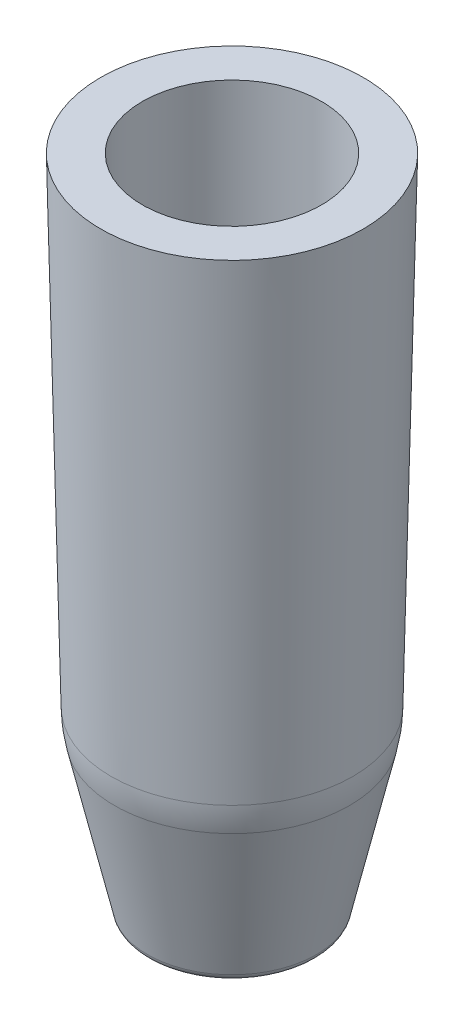
ISO-10303-21;
HEADER;
FILE_DESCRIPTION(('STEP AP214'),'2;1');
FILE_NAME('part.step','',(''),(''),'','','');
FILE_SCHEMA(('AUTOMOTIVE_DESIGN { 1 0 10303 214 1 1 1 1 }'));
ENDSEC;
DATA;
#1=APPLICATION_CONTEXT('core data for automotive mechanical design processes');
#2=APPLICATION_PROTOCOL_DEFINITION('international standard','automotive_design',2000,#1);
#3=PRODUCT_CONTEXT('',#1,'mechanical');
#4=PRODUCT('Part','Part','',(#3));
#5=PRODUCT_RELATED_PRODUCT_CATEGORY('part','',(#4));
#6=PRODUCT_DEFINITION_FORMATION('','',#4);
#7=PRODUCT_DEFINITION_CONTEXT('part definition',#1,'design');
#8=PRODUCT_DEFINITION('design','',#6,#7);
#9=PRODUCT_DEFINITION_SHAPE('','',#8);
#10=(LENGTH_UNIT() NAMED_UNIT(*) SI_UNIT(.MILLI.,.METRE.));
#11=(NAMED_UNIT(*) PLANE_ANGLE_UNIT() SI_UNIT($,.RADIAN.));
#12=(NAMED_UNIT(*) SI_UNIT($,.STERADIAN.) SOLID_ANGLE_UNIT());
#13=UNCERTAINTY_MEASURE_WITH_UNIT(LENGTH_MEASURE(1.E-05),#10,'distance_accuracy_value','');
#14=(GEOMETRIC_REPRESENTATION_CONTEXT(3) GLOBAL_UNCERTAINTY_ASSIGNED_CONTEXT((#13)) GLOBAL_UNIT_ASSIGNED_CONTEXT((#10,
#11,#12)) REPRESENTATION_CONTEXT('',''));
#15=CARTESIAN_POINT('',(0.,0.,0.));
#16=DIRECTION('',(0.,0.,1.));
#17=DIRECTION('',(1.,0.,0.));
#18=AXIS2_PLACEMENT_3D('',#15,#16,#17);
#19=CARTESIAN_POINT('',(0.,-10.6314650693562,0.));
#20=DIRECTION('',(0.,-1.,0.));
#21=DIRECTION('',(0.,0.,1.));
#22=AXIS2_PLACEMENT_3D('',#19,#20,#21);
#23=DEGENERATE_TOROIDAL_SURFACE('',#22,0.302673202506383,3.00000000000032,.F.);
#24=CARTESIAN_POINT('',(0.,-11.2956448576562,0.));
#25=DIRECTION('',(0.,-1.,0.));
#26=DIRECTION('',(1.,0.,0.));
#27=AXIS2_PLACEMENT_3D('',#24,#25,#26);
#28=CIRCLE('',#27,2.62288062691049);
#29=CARTESIAN_POINT('',(2.62288062691049,-11.2956448576562,0.));
#30=VERTEX_POINT('',#29);
#31=EDGE_CURVE('E32',#30,#30,#28,.T.);
#32=ORIENTED_EDGE('',*,*,#31,.F.);
#33=EDGE_LOOP('',(#32));
#34=FACE_BOUND('',#33,.T.);
#35=CARTESIAN_POINT('',(0.,-10.696904041107,0.));
#36=DIRECTION('',(0.,1.,0.));
#37=DIRECTION('',(1.,0.,0.));
#38=AXIS2_PLACEMENT_3D('',#35,#36,#37);
#39=CIRCLE('',#38,2.69661300273948);
#40=CARTESIAN_POINT('',(2.69661300273948,-10.696904041107,0.));
#41=VERTEX_POINT('',#40);
#42=EDGE_CURVE('E45',#41,#41,#39,.T.);
#43=ORIENTED_EDGE('',*,*,#42,.F.);
#44=EDGE_LOOP('',(#43));
#45=FACE_BOUND('',#44,.T.);
#46=ADVANCED_FACE('F15',(#34,#45),#23,.F.);
#47=CARTESIAN_POINT('',(0.,-14.5,0.));
#48=DIRECTION('',(0.,-1.,0.));
#49=DIRECTION('',(1.,0.,0.));
#50=AXIS2_PLACEMENT_3D('',#47,#48,#49);
#51=TOROIDAL_SURFACE('',#50,1.69031603259436,0.2);
#52=CARTESIAN_POINT('',(0.,-14.7,0.));
#53=DIRECTION('',(0.,-1.,0.));
#54=DIRECTION('',(1.,0.,0.));
#55=AXIS2_PLACEMENT_3D('',#52,#53,#54);
#56=CIRCLE('',#55,1.69031603259436);
#57=CARTESIAN_POINT('',(1.69031603259436,-14.7,0.));
#58=VERTEX_POINT('',#57);
#59=EDGE_CURVE('E50',#58,#58,#56,.T.);
#60=ORIENTED_EDGE('',*,*,#59,.F.);
#61=EDGE_LOOP('',(#60));
#62=FACE_BOUND('',#61,.T.);
#63=CARTESIAN_POINT('',(0.,-14.5442786525533,0.));
#64=DIRECTION('',(0.,1.,0.));
#65=DIRECTION('',(1.,0.,0.));
#66=AXIS2_PLACEMENT_3D('',#63,#64,#65);
#67=CIRCLE('',#66,1.88535295455546);
#68=CARTESIAN_POINT('',(1.88535295455546,-14.5442786525533,0.));
#69=VERTEX_POINT('',#68);
#70=EDGE_CURVE('E40',#69,#69,#67,.T.);
#71=ORIENTED_EDGE('',*,*,#70,.F.);
#72=EDGE_LOOP('',(#71));
#73=FACE_BOUND('',#72,.T.);
#74=ADVANCED_FACE('F17',(#62,#73),#51,.T.);
#75=CARTESIAN_POINT('',(0.,0.,0.));
#76=DIRECTION('',(0.,1.,0.));
#77=DIRECTION('',(-1.,0.,0.));
#78=AXIS2_PLACEMENT_3D('',#75,#76,#77);
#79=CYLINDRICAL_SURFACE('',#78,2.);
#80=CARTESIAN_POINT('',(0.,-7.8,0.));
#81=DIRECTION('',(0.,1.,0.));
#82=DIRECTION('',(-1.,0.,0.));
#83=AXIS2_PLACEMENT_3D('',#80,#81,#82);
#84=CIRCLE('',#83,2.);
#85=CARTESIAN_POINT('',(-2.,-7.8,0.));
#86=VERTEX_POINT('',#85);
#87=EDGE_CURVE('E10',#86,#86,#84,.T.);
#88=ORIENTED_EDGE('',*,*,#87,.F.);
#89=EDGE_LOOP('',(#88));
#90=FACE_BOUND('',#89,.T.);
#91=CARTESIAN_POINT('',(0.,0.,0.));
#92=DIRECTION('',(0.,1.,0.));
#93=DIRECTION('',(-1.,0.,0.));
#94=AXIS2_PLACEMENT_3D('',#91,#92,#93);
#95=CIRCLE('',#94,2.);
#96=CARTESIAN_POINT('',(-2.,0.,0.));
#97=VERTEX_POINT('',#96);
#98=EDGE_CURVE('E58',#97,#97,#95,.T.);
#99=ORIENTED_EDGE('',*,*,#98,.T.);
#100=EDGE_LOOP('',(#99));
#101=FACE_BOUND('',#100,.T.);
#102=ADVANCED_FACE('F73',(#90,#101),#79,.F.);
#103=CARTESIAN_POINT('',(0.,-8.1,0.));
#104=DIRECTION('',(0.,1.,0.));
#105=DIRECTION('',(-1.,0.,0.));
#106=AXIS2_PLACEMENT_3D('',#103,#104,#105);
#107=CONICAL_SURFACE('',#106,1.7,0.785398163397448);
#108=CARTESIAN_POINT('',(0.,-8.1,0.));
#109=DIRECTION('',(0.,1.,0.));
#110=DIRECTION('',(-1.,0.,0.));
#111=AXIS2_PLACEMENT_3D('',#108,#109,#110);
#112=CIRCLE('',#111,1.7);
#113=CARTESIAN_POINT('',(-1.7,-8.1,0.));
#114=VERTEX_POINT('',#113);
#115=EDGE_CURVE('E23',#114,#114,#112,.T.);
#116=ORIENTED_EDGE('',*,*,#115,.F.);
#117=EDGE_LOOP('',(#116));
#118=FACE_BOUND('',#117,.T.);
#119=ORIENTED_EDGE('',*,*,#87,.T.);
#120=EDGE_LOOP('',(#119));
#121=FACE_BOUND('',#120,.T.);
#122=ADVANCED_FACE('F89',(#118,#121),#107,.F.);
#123=CARTESIAN_POINT('',(0.,-14.7,0.));
#124=DIRECTION('',(0.,1.,0.));
#125=DIRECTION('',(-1.,0.,0.));
#126=AXIS2_PLACEMENT_3D('',#123,#124,#125);
#127=CONICAL_SURFACE('',#126,1.,0.105665582099856);
#128=CARTESIAN_POINT('',(0.,-14.7,0.));
#129=DIRECTION('',(0.,1.,0.));
#130=DIRECTION('',(-1.,0.,0.));
#131=AXIS2_PLACEMENT_3D('',#128,#129,#130);
#132=CIRCLE('',#131,1.);
#133=CARTESIAN_POINT('',(-0.999999999999998,-14.7,0.));
#134=VERTEX_POINT('',#133);
#135=EDGE_CURVE('E46',#134,#134,#132,.T.);
#136=ORIENTED_EDGE('',*,*,#135,.F.);
#137=EDGE_LOOP('',(#136));
#138=FACE_BOUND('',#137,.T.);
#139=ORIENTED_EDGE('',*,*,#115,.T.);
#140=EDGE_LOOP('',(#139));
#141=FACE_BOUND('',#140,.T.);
#142=ADVANCED_FACE('F79',(#138,#141),#127,.F.);
#143=CARTESIAN_POINT('',(0.,-11.,0.));
#144=DIRECTION('',(0.,1.,0.));
#145=DIRECTION('',(-1.,0.,0.));
#146=AXIS2_PLACEMENT_3D('',#143,#144,#145);
#147=CONICAL_SURFACE('',#146,2.69,0.223242956285072);
#148=ORIENTED_EDGE('',*,*,#31,.T.);
#149=EDGE_LOOP('',(#148));
#150=FACE_BOUND('',#149,.T.);
#151=ORIENTED_EDGE('',*,*,#70,.T.);
#152=EDGE_LOOP('',(#151));
#153=FACE_BOUND('',#152,.T.);
#154=ADVANCED_FACE('F76',(#150,#153),#147,.T.);
#155=CARTESIAN_POINT('',(0.,0.,0.));
#156=DIRECTION('',(0.,1.,0.));
#157=DIRECTION('',(-1.,0.,0.));
#158=AXIS2_PLACEMENT_3D('',#155,#156,#157);
#159=CONICAL_SURFACE('',#158,2.93,0.021814720748078);
#160=CARTESIAN_POINT('',(0.,0.,0.));
#161=DIRECTION('',(0.,1.,0.));
#162=DIRECTION('',(-1.,0.,0.));
#163=AXIS2_PLACEMENT_3D('',#160,#161,#162);
#164=CIRCLE('',#163,2.93);
#165=CARTESIAN_POINT('',(-2.93,0.,0.));
#166=VERTEX_POINT('',#165);
#167=EDGE_CURVE('E51',#166,#166,#164,.T.);
#168=ORIENTED_EDGE('',*,*,#167,.F.);
#169=EDGE_LOOP('',(#168));
#170=FACE_BOUND('',#169,.T.);
#171=ORIENTED_EDGE('',*,*,#42,.T.);
#172=EDGE_LOOP('',(#171));
#173=FACE_BOUND('',#172,.T.);
#174=ADVANCED_FACE('F78',(#170,#173),#159,.T.);
#175=CARTESIAN_POINT('',(-1.85,-14.7,0.));
#176=DIRECTION('',(0.,-1.,0.));
#177=DIRECTION('',(0.,0.,-1.));
#178=AXIS2_PLACEMENT_3D('',#175,#176,#177);
#179=PLANE('',#178);
#180=ORIENTED_EDGE('',*,*,#59,.T.);
#181=EDGE_LOOP('',(#180));
#182=FACE_BOUND('',#181,.T.);
#183=ORIENTED_EDGE('',*,*,#135,.T.);
#184=EDGE_LOOP('',(#183));
#185=FACE_BOUND('',#184,.T.);
#186=ADVANCED_FACE('F68',(#182,#185),#179,.T.);
#187=CARTESIAN_POINT('',(-2.,0.,0.));
#188=DIRECTION('',(0.,1.,0.));
#189=DIRECTION('',(1.,0.,0.));
#190=AXIS2_PLACEMENT_3D('',#187,#188,#189);
#191=PLANE('',#190);
#192=ORIENTED_EDGE('',*,*,#167,.T.);
#193=EDGE_LOOP('',(#192));
#194=FACE_BOUND('',#193,.T.);
#195=ORIENTED_EDGE('',*,*,#98,.F.);
#196=EDGE_LOOP('',(#195));
#197=FACE_BOUND('',#196,.T.);
#198=ADVANCED_FACE('F109',(#194,#197),#191,.T.);
#199=CLOSED_SHELL('',(#46,#74,#102,#122,#142,#154,#174,#186,#198));
#200=MANIFOLD_SOLID_BREP('B1',#199);
#201=ADVANCED_BREP_SHAPE_REPRESENTATION('',(#18,#200),#14);
#202=SHAPE_DEFINITION_REPRESENTATION(#9,#201);
ENDSEC;
END-ISO-10303-21;
